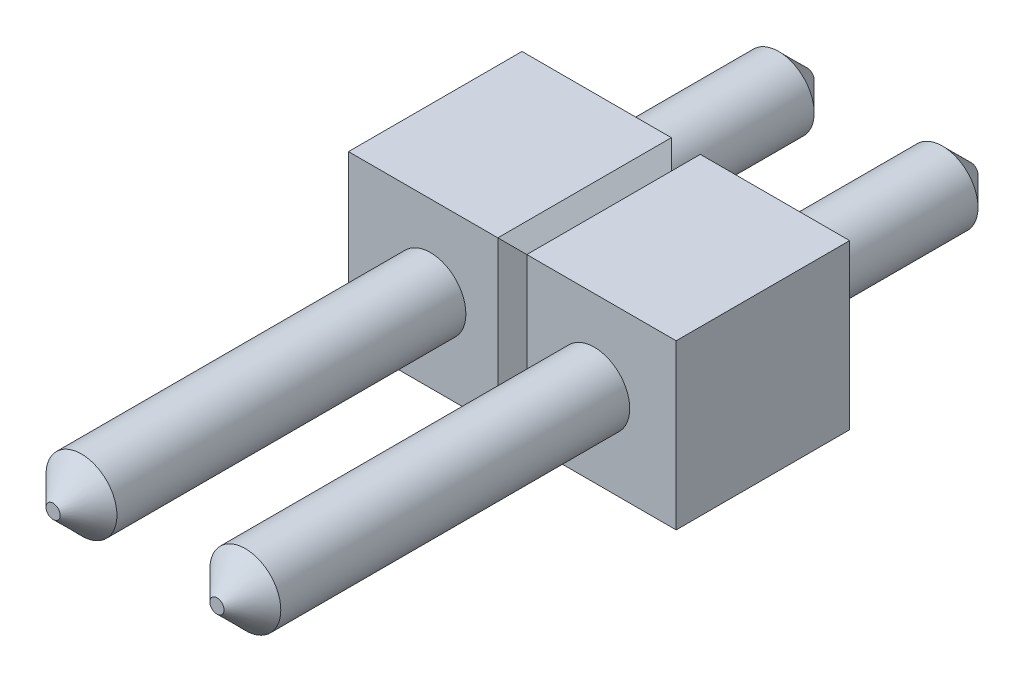
ISO-10303-21;
HEADER;
FILE_DESCRIPTION(('STEP AP214'),'2;1');
FILE_NAME('part.step','',(''),(''),'','','');
FILE_SCHEMA(('AUTOMOTIVE_DESIGN { 1 0 10303 214 1 1 1 1 }'));
ENDSEC;
DATA;
#1=APPLICATION_CONTEXT('core data for automotive mechanical design processes');
#2=APPLICATION_PROTOCOL_DEFINITION('international standard','automotive_design',2000,#1);
#3=PRODUCT_CONTEXT('',#1,'mechanical');
#4=PRODUCT('Part','Part','',(#3));
#5=PRODUCT_RELATED_PRODUCT_CATEGORY('part','',(#4));
#6=PRODUCT_DEFINITION_FORMATION('','',#4);
#7=PRODUCT_DEFINITION_CONTEXT('part definition',#1,'design');
#8=PRODUCT_DEFINITION('design','',#6,#7);
#9=PRODUCT_DEFINITION_SHAPE('','',#8);
#10=(LENGTH_UNIT() NAMED_UNIT(*) SI_UNIT(.MILLI.,.METRE.));
#11=(NAMED_UNIT(*) PLANE_ANGLE_UNIT() SI_UNIT($,.RADIAN.));
#12=(NAMED_UNIT(*) SI_UNIT($,.STERADIAN.) SOLID_ANGLE_UNIT());
#13=UNCERTAINTY_MEASURE_WITH_UNIT(LENGTH_MEASURE(1.E-05),#10,'distance_accuracy_value','');
#14=(GEOMETRIC_REPRESENTATION_CONTEXT(3) GLOBAL_UNCERTAINTY_ASSIGNED_CONTEXT((#13)) GLOBAL_UNIT_ASSIGNED_CONTEXT((#10,
#11,#12)) REPRESENTATION_CONTEXT('',''));
#15=CARTESIAN_POINT('',(0.,0.,0.));
#16=DIRECTION('',(0.,0.,1.));
#17=DIRECTION('',(1.,0.,0.));
#18=AXIS2_PLACEMENT_3D('',#15,#16,#17);
#19=CARTESIAN_POINT('',(-1.27,-1.27,0.));
#20=DIRECTION('',(1.,0.,0.));
#21=DIRECTION('',(0.,0.,1.));
#22=AXIS2_PLACEMENT_3D('',#19,#20,#21);
#23=PLANE('',#22);
#24=DIRECTION('',(0.,1.,0.));
#25=VECTOR('',#24,1.);
#26=CARTESIAN_POINT('',(-1.27,-1.27,2.69));
#27=LINE('',#26,#25);
#28=CARTESIAN_POINT('',(-1.27,-1.27,2.69));
#29=VERTEX_POINT('',#28);
#30=CARTESIAN_POINT('',(-1.27,1.27,2.69));
#31=VERTEX_POINT('',#30);
#32=EDGE_CURVE('P0_E11',#29,#31,#27,.T.);
#33=ORIENTED_EDGE('',*,*,#32,.T.);
#34=DIRECTION('',(0.,0.,1.));
#35=VECTOR('',#34,1.);
#36=CARTESIAN_POINT('',(-1.27,1.27,0.));
#37=LINE('',#36,#35);
#38=CARTESIAN_POINT('',(-1.27,1.27,0.));
#39=VERTEX_POINT('',#38);
#40=EDGE_CURVE('P0_E24',#39,#31,#37,.T.);
#41=ORIENTED_EDGE('',*,*,#40,.F.);
#42=DIRECTION('',(0.,1.,0.));
#43=VECTOR('',#42,1.);
#44=CARTESIAN_POINT('',(-1.27,-1.27,0.));
#45=LINE('',#44,#43);
#46=CARTESIAN_POINT('',(-1.27,-1.27,0.));
#47=VERTEX_POINT('',#46);
#48=EDGE_CURVE('P0_E189',#47,#39,#45,.T.);
#49=ORIENTED_EDGE('',*,*,#48,.F.);
#50=DIRECTION('',(0.,0.,1.));
#51=VECTOR('',#50,1.);
#52=CARTESIAN_POINT('',(-1.27,-1.27,0.));
#53=LINE('',#52,#51);
#54=EDGE_CURVE('P0_E36',#47,#29,#53,.T.);
#55=ORIENTED_EDGE('',*,*,#54,.T.);
#56=EDGE_LOOP('',(#33,#41,#49,#55));
#57=FACE_BOUND('',#56,.T.);
#58=ADVANCED_FACE('P0_F17',(#57),#23,.F.);
#59=CARTESIAN_POINT('',(-1.27,-1.27,0.));
#60=DIRECTION('',(0.,1.,0.));
#61=DIRECTION('',(0.,0.,1.));
#62=AXIS2_PLACEMENT_3D('',#59,#60,#61);
#63=PLANE('',#62);
#64=DIRECTION('',(0.,0.,1.));
#65=VECTOR('',#64,1.);
#66=CARTESIAN_POINT('',(1.045493596973,-1.27,0.));
#67=LINE('',#66,#65);
#68=CARTESIAN_POINT('',(1.045493596973,-1.27,0.));
#69=VERTEX_POINT('',#68);
#70=CARTESIAN_POINT('',(1.045493596973,-1.27,2.69));
#71=VERTEX_POINT('',#70);
#72=EDGE_CURVE('P0_E185',#69,#71,#67,.T.);
#73=ORIENTED_EDGE('',*,*,#72,.T.);
#74=DIRECTION('',(1.,0.,0.));
#75=VECTOR('',#74,1.);
#76=CARTESIAN_POINT('',(-1.27,-1.27,2.69));
#77=LINE('',#76,#75);
#78=EDGE_CURVE('P0_E183',#29,#71,#77,.T.);
#79=ORIENTED_EDGE('',*,*,#78,.F.);
#80=ORIENTED_EDGE('',*,*,#54,.F.);
#81=DIRECTION('',(1.,0.,0.));
#82=VECTOR('',#81,1.);
#83=CARTESIAN_POINT('',(-1.27,-1.27,0.));
#84=LINE('',#83,#82);
#85=EDGE_CURVE('P0_E181',#47,#69,#84,.T.);
#86=ORIENTED_EDGE('',*,*,#85,.T.);
#87=EDGE_LOOP('',(#73,#79,#80,#86));
#88=FACE_BOUND('',#87,.T.);
#89=ADVANCED_FACE('P0_F221',(#88),#63,.F.);
#90=CARTESIAN_POINT('',(-1.27,-1.27,2.69));
#91=DIRECTION('',(0.,0.,1.));
#92=DIRECTION('',(1.,0.,0.));
#93=AXIS2_PLACEMENT_3D('',#90,#91,#92);
#94=PLANE('',#93);
#95=DIRECTION('',(1.,0.,0.));
#96=VECTOR('',#95,1.);
#97=CARTESIAN_POINT('',(-1.27,1.27,2.69));
#98=LINE('',#97,#96);
#99=CARTESIAN_POINT('',(1.045493596973,1.27,2.69));
#100=VERTEX_POINT('',#99);
#101=EDGE_CURVE('P0_E179',#31,#100,#98,.T.);
#102=ORIENTED_EDGE('',*,*,#101,.F.);
#103=ORIENTED_EDGE('',*,*,#32,.F.);
#104=ORIENTED_EDGE('',*,*,#78,.T.);
#105=DIRECTION('',(0.,1.,0.));
#106=VECTOR('',#105,1.);
#107=CARTESIAN_POINT('',(1.045493596973,-1.27,2.69));
#108=LINE('',#107,#106);
#109=EDGE_CURVE('P0_E176',#71,#100,#108,.T.);
#110=ORIENTED_EDGE('',*,*,#109,.T.);
#111=EDGE_LOOP('',(#102,#103,#104,#110));
#112=FACE_BOUND('',#111,.T.);
#113=ADVANCED_FACE('P0_F218',(#112),#94,.T.);
#114=CARTESIAN_POINT('',(-1.27,1.27,0.));
#115=DIRECTION('',(0.,1.,0.));
#116=DIRECTION('',(0.,0.,1.));
#117=AXIS2_PLACEMENT_3D('',#114,#115,#116);
#118=PLANE('',#117);
#119=DIRECTION('',(1.,0.,0.));
#120=VECTOR('',#119,1.);
#121=CARTESIAN_POINT('',(-1.27,1.27,0.));
#122=LINE('',#121,#120);
#123=CARTESIAN_POINT('',(1.045493596973,1.27,0.));
#124=VERTEX_POINT('',#123);
#125=EDGE_CURVE('P0_E173',#39,#124,#122,.T.);
#126=ORIENTED_EDGE('',*,*,#125,.F.);
#127=ORIENTED_EDGE('',*,*,#40,.T.);
#128=ORIENTED_EDGE('',*,*,#101,.T.);
#129=DIRECTION('',(0.,0.,1.));
#130=VECTOR('',#129,1.);
#131=CARTESIAN_POINT('',(1.045493596973,1.27,0.));
#132=LINE('',#131,#130);
#133=EDGE_CURVE('P0_E170',#124,#100,#132,.T.);
#134=ORIENTED_EDGE('',*,*,#133,.F.);
#135=EDGE_LOOP('',(#126,#127,#128,#134));
#136=FACE_BOUND('',#135,.T.);
#137=ADVANCED_FACE('P0_F196',(#136),#118,.T.);
#138=CARTESIAN_POINT('',(-1.27,-1.27,0.));
#139=DIRECTION('',(0.,0.,1.));
#140=DIRECTION('',(1.,0.,0.));
#141=AXIS2_PLACEMENT_3D('',#138,#139,#140);
#142=PLANE('',#141);
#143=DIRECTION('',(0.,1.,0.));
#144=VECTOR('',#143,1.);
#145=CARTESIAN_POINT('',(1.045493596973,-1.27,0.));
#146=LINE('',#145,#144);
#147=EDGE_CURVE('P0_E167',#69,#124,#146,.T.);
#148=ORIENTED_EDGE('',*,*,#147,.F.);
#149=ORIENTED_EDGE('',*,*,#85,.F.);
#150=ORIENTED_EDGE('',*,*,#48,.T.);
#151=ORIENTED_EDGE('',*,*,#125,.T.);
#152=EDGE_LOOP('',(#148,#149,#150,#151));
#153=FACE_BOUND('',#152,.T.);
#154=ADVANCED_FACE('P0_F193',(#153),#142,.F.);
#155=CARTESIAN_POINT('',(1.045493596973,-1.27,0.));
#156=DIRECTION('',(-0.707106781186547,0.707106781186548,0.));
#157=DIRECTION('',(0.,0.,1.));
#158=AXIS2_PLACEMENT_3D('',#155,#156,#157);
#159=PLANE('',#158);
#160=DIRECTION('',(0.,0.,1.));
#161=VECTOR('',#160,1.);
#162=CARTESIAN_POINT('',(1.27,-1.045493596973,0.));
#163=LINE('',#162,#161);
#164=CARTESIAN_POINT('',(1.27,-1.045493596973,0.224506403027));
#165=VERTEX_POINT('',#164);
#166=CARTESIAN_POINT('',(1.27,-1.045493596973,2.465493596973));
#167=VERTEX_POINT('',#166);
#168=EDGE_CURVE('P0_E164',#165,#167,#163,.T.);
#169=ORIENTED_EDGE('',*,*,#168,.T.);
#170=DIRECTION('',(0.577350269189626,0.577350269189626,-0.577350269189626));
#171=VECTOR('',#170,1.);
#172=CARTESIAN_POINT('',(1.493826930307,-0.821666666667,2.241666666667));
#173=LINE('',#172,#171);
#174=EDGE_CURVE('P0_E161',#71,#167,#173,.T.);
#175=ORIENTED_EDGE('',*,*,#174,.F.);
#176=ORIENTED_EDGE('',*,*,#72,.F.);
#177=DIRECTION('',(-0.577350269189626,-0.577350269189626,-0.577350269189626));
#178=VECTOR('',#177,1.);
#179=CARTESIAN_POINT('',(1.045493596973,-1.27,0.));
#180=LINE('',#179,#178);
#181=EDGE_CURVE('P0_E158',#165,#69,#180,.T.);
#182=ORIENTED_EDGE('',*,*,#181,.F.);
#183=EDGE_LOOP('',(#169,#175,#176,#182));
#184=FACE_BOUND('',#183,.T.);
#185=ADVANCED_FACE('P0_F206',(#184),#159,.F.);
#186=CARTESIAN_POINT('',(1.045493596973,-1.27,2.69));
#187=DIRECTION('',(0.707106781186548,0.,0.707106781186548));
#188=DIRECTION('',(0.707106781186548,0.,-0.707106781186548));
#189=AXIS2_PLACEMENT_3D('',#186,#187,#188);
#190=PLANE('',#189);
#191=ORIENTED_EDGE('',*,*,#109,.F.);
#192=ORIENTED_EDGE('',*,*,#174,.T.);
#193=DIRECTION('',(0.,1.,0.));
#194=VECTOR('',#193,1.);
#195=CARTESIAN_POINT('',(1.27,-1.27,2.465493596973));
#196=LINE('',#195,#194);
#197=CARTESIAN_POINT('',(1.27,1.045493596973,2.465493596973));
#198=VERTEX_POINT('',#197);
#199=EDGE_CURVE('P0_E155',#167,#198,#196,.T.);
#200=ORIENTED_EDGE('',*,*,#199,.T.);
#201=DIRECTION('',(0.577350269189626,-0.577350269189626,-0.577350269189626));
#202=VECTOR('',#201,1.);
#203=CARTESIAN_POINT('',(1.991995731316,0.323497865658,1.743497865658));
#204=LINE('',#203,#202);
#205=EDGE_CURVE('P0_E152',#100,#198,#204,.T.);
#206=ORIENTED_EDGE('',*,*,#205,.F.);
#207=EDGE_LOOP('',(#191,#192,#200,#206));
#208=FACE_BOUND('',#207,.T.);
#209=ADVANCED_FACE('P0_F216',(#208),#190,.T.);
#210=CARTESIAN_POINT('',(1.27,1.045493596973,0.));
#211=DIRECTION('',(0.707106781186548,0.707106781186547,0.));
#212=DIRECTION('',(0.,0.,1.));
#213=AXIS2_PLACEMENT_3D('',#210,#211,#212);
#214=PLANE('',#213);
#215=DIRECTION('',(0.,0.,1.));
#216=VECTOR('',#215,1.);
#217=CARTESIAN_POINT('',(1.27,1.045493596973,0.));
#218=LINE('',#217,#216);
#219=CARTESIAN_POINT('',(1.27,1.045493596973,0.224506403027));
#220=VERTEX_POINT('',#219);
#221=EDGE_CURVE('P0_E149',#220,#198,#218,.T.);
#222=ORIENTED_EDGE('',*,*,#221,.F.);
#223=DIRECTION('',(-0.577350269189626,0.577350269189626,-0.577350269189626));
#224=VECTOR('',#223,1.);
#225=CARTESIAN_POINT('',(1.543662397982,0.771831198991,0.498168801009));
#226=LINE('',#225,#224);
#227=EDGE_CURVE('P0_E147',#220,#124,#226,.T.);
#228=ORIENTED_EDGE('',*,*,#227,.T.);
#229=ORIENTED_EDGE('',*,*,#133,.T.);
#230=ORIENTED_EDGE('',*,*,#205,.T.);
#231=EDGE_LOOP('',(#222,#228,#229,#230));
#232=FACE_BOUND('',#231,.T.);
#233=ADVANCED_FACE('P0_F238',(#232),#214,.T.);
#234=CARTESIAN_POINT('',(1.045493596973,-1.27,0.));
#235=DIRECTION('',(0.707106781186548,0.,-0.707106781186548));
#236=DIRECTION('',(0.707106781186548,0.,0.707106781186548));
#237=AXIS2_PLACEMENT_3D('',#234,#235,#236);
#238=PLANE('',#237);
#239=ORIENTED_EDGE('',*,*,#181,.T.);
#240=ORIENTED_EDGE('',*,*,#147,.T.);
#241=ORIENTED_EDGE('',*,*,#227,.F.);
#242=DIRECTION('',(0.,1.,0.));
#243=VECTOR('',#242,1.);
#244=CARTESIAN_POINT('',(1.27,-1.27,0.224506403027));
#245=LINE('',#244,#243);
#246=EDGE_CURVE('P0_E144',#165,#220,#245,.T.);
#247=ORIENTED_EDGE('',*,*,#246,.F.);
#248=EDGE_LOOP('',(#239,#240,#241,#247));
#249=FACE_BOUND('',#248,.T.);
#250=ADVANCED_FACE('P0_F200',(#249),#238,.T.);
#251=CARTESIAN_POINT('',(1.494506403027,-1.27,0.));
#252=DIRECTION('',(0.707106781186548,0.707106781186547,0.));
#253=DIRECTION('',(0.,0.,1.));
#254=AXIS2_PLACEMENT_3D('',#251,#252,#253);
#255=PLANE('',#254);
#256=DIRECTION('',(-0.577350269189626,0.577350269189626,-0.577350269189626));
#257=VECTOR('',#256,1.);
#258=CARTESIAN_POINT('',(0.971337602018,-0.746831198991,2.166831198991));
#259=LINE('',#258,#257);
#260=CARTESIAN_POINT('',(1.494506403027,-1.27,2.69));
#261=VERTEX_POINT('',#260);
#262=EDGE_CURVE('P0_E142',#261,#167,#259,.T.);
#263=ORIENTED_EDGE('',*,*,#262,.T.);
#264=ORIENTED_EDGE('',*,*,#168,.F.);
#265=DIRECTION('',(0.577350269189626,-0.577350269189626,-0.577350269189626));
#266=VECTOR('',#265,1.);
#267=CARTESIAN_POINT('',(1.419670935351,-1.195164532324,0.07483546767558));
#268=LINE('',#267,#266);
#269=CARTESIAN_POINT('',(1.494506403027,-1.27,0.));
#270=VERTEX_POINT('',#269);
#271=EDGE_CURVE('P0_E139',#165,#270,#268,.T.);
#272=ORIENTED_EDGE('',*,*,#271,.T.);
#273=DIRECTION('',(0.,0.,1.));
#274=VECTOR('',#273,1.);
#275=CARTESIAN_POINT('',(1.494506403027,-1.27,0.));
#276=LINE('',#275,#274);
#277=EDGE_CURVE('P0_E137',#270,#261,#276,.T.);
#278=ORIENTED_EDGE('',*,*,#277,.T.);
#279=EDGE_LOOP('',(#263,#264,#272,#278));
#280=FACE_BOUND('',#279,.T.);
#281=ADVANCED_FACE('P0_F210',(#280),#255,.F.);
#282=CARTESIAN_POINT('',(1.27,-1.27,2.465493596973));
#283=DIRECTION('',(0.707106781186548,0.,-0.707106781186548));
#284=DIRECTION('',(0.707106781186548,0.,0.707106781186548));
#285=AXIS2_PLACEMENT_3D('',#282,#283,#284);
#286=PLANE('',#285);
#287=DIRECTION('',(-0.577350269189626,-0.577350269189626,-0.577350269189626));
#288=VECTOR('',#287,1.);
#289=CARTESIAN_POINT('',(0.473168801009,0.248662397982,1.668662397982));
#290=LINE('',#289,#288);
#291=CARTESIAN_POINT('',(1.494506403027,1.27,2.69));
#292=VERTEX_POINT('',#291);
#293=EDGE_CURVE('P0_E135',#292,#198,#290,.T.);
#294=ORIENTED_EDGE('',*,*,#293,.T.);
#295=ORIENTED_EDGE('',*,*,#199,.F.);
#296=ORIENTED_EDGE('',*,*,#262,.F.);
#297=DIRECTION('',(0.,1.,0.));
#298=VECTOR('',#297,1.);
#299=CARTESIAN_POINT('',(1.494506403027,-1.27,2.69));
#300=LINE('',#299,#298);
#301=EDGE_CURVE('P0_E133',#261,#292,#300,.T.);
#302=ORIENTED_EDGE('',*,*,#301,.T.);
#303=EDGE_LOOP('',(#294,#295,#296,#302));
#304=FACE_BOUND('',#303,.T.);
#305=ADVANCED_FACE('P0_F245',(#304),#286,.F.);
#306=CARTESIAN_POINT('',(1.27,1.045493596973,0.));
#307=DIRECTION('',(-0.707106781186547,0.707106781186548,0.));
#308=DIRECTION('',(0.,0.,1.));
#309=AXIS2_PLACEMENT_3D('',#306,#307,#308);
#310=PLANE('',#309);
#311=DIRECTION('',(0.,0.,1.));
#312=VECTOR('',#311,1.);
#313=CARTESIAN_POINT('',(1.494506403027,1.27,0.));
#314=LINE('',#313,#312);
#315=CARTESIAN_POINT('',(1.494506403027,1.27,0.));
#316=VERTEX_POINT('',#315);
#317=EDGE_CURVE('P0_E131',#316,#292,#314,.T.);
#318=ORIENTED_EDGE('',*,*,#317,.F.);
#319=DIRECTION('',(0.577350269189626,0.577350269189626,-0.577350269189626));
#320=VECTOR('',#319,1.);
#321=CARTESIAN_POINT('',(0.921502134342,0.696995731316,0.573004268684));
#322=LINE('',#321,#320);
#323=EDGE_CURVE('P0_E128',#220,#316,#322,.T.);
#324=ORIENTED_EDGE('',*,*,#323,.F.);
#325=ORIENTED_EDGE('',*,*,#221,.T.);
#326=ORIENTED_EDGE('',*,*,#293,.F.);
#327=EDGE_LOOP('',(#318,#324,#325,#326));
#328=FACE_BOUND('',#327,.T.);
#329=ADVANCED_FACE('P0_F248',(#328),#310,.T.);
#330=CARTESIAN_POINT('',(1.27,-1.27,0.224506403027));
#331=DIRECTION('',(0.707106781186548,0.,0.707106781186548));
#332=DIRECTION('',(0.707106781186548,0.,-0.707106781186548));
#333=AXIS2_PLACEMENT_3D('',#330,#331,#332);
#334=PLANE('',#333);
#335=ORIENTED_EDGE('',*,*,#323,.T.);
#336=DIRECTION('',(0.,1.,0.));
#337=VECTOR('',#336,1.);
#338=CARTESIAN_POINT('',(1.494506403027,-1.27,0.));
#339=LINE('',#338,#337);
#340=EDGE_CURVE('P0_E100',#270,#316,#339,.T.);
#341=ORIENTED_EDGE('',*,*,#340,.F.);
#342=ORIENTED_EDGE('',*,*,#271,.F.);
#343=ORIENTED_EDGE('',*,*,#246,.T.);
#344=EDGE_LOOP('',(#335,#341,#342,#343));
#345=FACE_BOUND('',#344,.T.);
#346=ADVANCED_FACE('P0_F251',(#345),#334,.F.);
#347=CARTESIAN_POINT('',(-1.27,-1.27,0.));
#348=DIRECTION('',(0.,1.,0.));
#349=DIRECTION('',(0.,0.,1.));
#350=AXIS2_PLACEMENT_3D('',#347,#348,#349);
#351=PLANE('',#350);
#352=DIRECTION('',(0.,0.,1.));
#353=VECTOR('',#352,1.);
#354=CARTESIAN_POINT('',(3.81,-1.27,0.));
#355=LINE('',#354,#353);
#356=CARTESIAN_POINT('',(3.81,-1.27,0.));
#357=VERTEX_POINT('',#356);
#358=CARTESIAN_POINT('',(3.81,-1.27,2.69));
#359=VERTEX_POINT('',#358);
#360=EDGE_CURVE('P0_E117',#357,#359,#355,.T.);
#361=ORIENTED_EDGE('',*,*,#360,.T.);
#362=DIRECTION('',(1.,0.,0.));
#363=VECTOR('',#362,1.);
#364=CARTESIAN_POINT('',(-1.27,-1.27,2.69));
#365=LINE('',#364,#363);
#366=EDGE_CURVE('P0_E124',#261,#359,#365,.T.);
#367=ORIENTED_EDGE('',*,*,#366,.F.);
#368=ORIENTED_EDGE('',*,*,#277,.F.);
#369=DIRECTION('',(1.,0.,0.));
#370=VECTOR('',#369,1.);
#371=CARTESIAN_POINT('',(-1.27,-1.27,0.));
#372=LINE('',#371,#370);
#373=EDGE_CURVE('P0_E122',#270,#357,#372,.T.);
#374=ORIENTED_EDGE('',*,*,#373,.T.);
#375=EDGE_LOOP('',(#361,#367,#368,#374));
#376=FACE_BOUND('',#375,.T.);
#377=ADVANCED_FACE('P0_F255',(#376),#351,.F.);
#378=CARTESIAN_POINT('',(-1.27,-1.27,2.69));
#379=DIRECTION('',(0.,0.,1.));
#380=DIRECTION('',(1.,0.,0.));
#381=AXIS2_PLACEMENT_3D('',#378,#379,#380);
#382=PLANE('',#381);
#383=DIRECTION('',(1.,0.,0.));
#384=VECTOR('',#383,1.);
#385=CARTESIAN_POINT('',(-1.27,1.27,2.69));
#386=LINE('',#385,#384);
#387=CARTESIAN_POINT('',(3.81,1.27,2.69));
#388=VERTEX_POINT('',#387);
#389=EDGE_CURVE('P0_E109',#292,#388,#386,.T.);
#390=ORIENTED_EDGE('',*,*,#389,.F.);
#391=ORIENTED_EDGE('',*,*,#301,.F.);
#392=ORIENTED_EDGE('',*,*,#366,.T.);
#393=DIRECTION('',(0.,1.,0.));
#394=VECTOR('',#393,1.);
#395=CARTESIAN_POINT('',(3.81,-1.27,2.69));
#396=LINE('',#395,#394);
#397=EDGE_CURVE('P0_E103',#359,#388,#396,.T.);
#398=ORIENTED_EDGE('',*,*,#397,.T.);
#399=EDGE_LOOP('',(#390,#391,#392,#398));
#400=FACE_BOUND('',#399,.T.);
#401=ADVANCED_FACE('P0_F259',(#400),#382,.T.);
#402=CARTESIAN_POINT('',(-1.27,1.27,0.));
#403=DIRECTION('',(0.,1.,0.));
#404=DIRECTION('',(0.,0.,1.));
#405=AXIS2_PLACEMENT_3D('',#402,#403,#404);
#406=PLANE('',#405);
#407=DIRECTION('',(1.,0.,0.));
#408=VECTOR('',#407,1.);
#409=CARTESIAN_POINT('',(-1.27,1.27,0.));
#410=LINE('',#409,#408);
#411=CARTESIAN_POINT('',(3.81,1.27,0.));
#412=VERTEX_POINT('',#411);
#413=EDGE_CURVE('P0_E93',#316,#412,#410,.T.);
#414=ORIENTED_EDGE('',*,*,#413,.F.);
#415=ORIENTED_EDGE('',*,*,#317,.T.);
#416=ORIENTED_EDGE('',*,*,#389,.T.);
#417=DIRECTION('',(0.,0.,1.));
#418=VECTOR('',#417,1.);
#419=CARTESIAN_POINT('',(3.81,1.27,0.));
#420=LINE('',#419,#418);
#421=EDGE_CURVE('P0_E104',#412,#388,#420,.T.);
#422=ORIENTED_EDGE('',*,*,#421,.F.);
#423=EDGE_LOOP('',(#414,#415,#416,#422));
#424=FACE_BOUND('',#423,.T.);
#425=ADVANCED_FACE('P0_F107',(#424),#406,.T.);
#426=CARTESIAN_POINT('',(-1.27,-1.27,0.));
#427=DIRECTION('',(0.,0.,1.));
#428=DIRECTION('',(1.,0.,0.));
#429=AXIS2_PLACEMENT_3D('',#426,#427,#428);
#430=PLANE('',#429);
#431=DIRECTION('',(0.,1.,0.));
#432=VECTOR('',#431,1.);
#433=CARTESIAN_POINT('',(3.81,-1.27,0.));
#434=LINE('',#433,#432);
#435=EDGE_CURVE('P0_E98',#357,#412,#434,.T.);
#436=ORIENTED_EDGE('',*,*,#435,.F.);
#437=ORIENTED_EDGE('',*,*,#373,.F.);
#438=ORIENTED_EDGE('',*,*,#340,.T.);
#439=ORIENTED_EDGE('',*,*,#413,.T.);
#440=EDGE_LOOP('',(#436,#437,#438,#439));
#441=FACE_BOUND('',#440,.T.);
#442=ADVANCED_FACE('P0_F95',(#441),#430,.F.);
#443=CARTESIAN_POINT('',(3.81,-1.27,0.));
#444=DIRECTION('',(1.,0.,0.));
#445=DIRECTION('',(0.,0.,1.));
#446=AXIS2_PLACEMENT_3D('',#443,#444,#445);
#447=PLANE('',#446);
#448=ORIENTED_EDGE('',*,*,#360,.F.);
#449=ORIENTED_EDGE('',*,*,#435,.T.);
#450=ORIENTED_EDGE('',*,*,#421,.T.);
#451=ORIENTED_EDGE('',*,*,#397,.F.);
#452=EDGE_LOOP('',(#448,#449,#450,#451));
#453=FACE_BOUND('',#452,.T.);
#454=ADVANCED_FACE('P0_F115',(#453),#447,.T.);
#455=CLOSED_SHELL('',(#58,#89,#113,#137,#154,#185,#209,#233,#250,#281,#305,#329,#346,#377,#401,
#425,#442,#454));
#456=MANIFOLD_SOLID_BREP('P0_B1',#455);
#457=CARTESIAN_POINT('',(0.,0.,-3.15));
#458=DIRECTION('',(0.,0.,1.));
#459=DIRECTION('',(1.,0.,0.));
#460=AXIS2_PLACEMENT_3D('',#457,#458,#459);
#461=CYLINDRICAL_SURFACE('',#460,0.55);
#462=DIRECTION('',(0.,0.,1.));
#463=VECTOR('',#462,1.);
#464=CARTESIAN_POINT('',(0.55,0.,-3.15));
#465=LINE('',#464,#463);
#466=CARTESIAN_POINT('',(0.55,0.,-2.71));
#467=VERTEX_POINT('',#466);
#468=CARTESIAN_POINT('',(0.55,0.,8.1));
#469=VERTEX_POINT('',#468);
#470=EDGE_CURVE('P1_E11',#467,#469,#465,.T.);
#471=ORIENTED_EDGE('',*,*,#470,.T.);
#472=CARTESIAN_POINT('',(0.,0.,8.1));
#473=DIRECTION('',(0.,0.,1.));
#474=DIRECTION('',(1.,0.,0.));
#475=AXIS2_PLACEMENT_3D('',#472,#473,#474);
#476=CIRCLE('',#475,0.55);
#477=EDGE_CURVE('P1_E24',#469,#469,#476,.T.);
#478=ORIENTED_EDGE('',*,*,#477,.F.);
#479=ORIENTED_EDGE('',*,*,#470,.F.);
#480=CARTESIAN_POINT('',(0.,0.,-2.71));
#481=DIRECTION('',(0.,0.,1.));
#482=DIRECTION('',(1.,0.,0.));
#483=AXIS2_PLACEMENT_3D('',#480,#481,#482);
#484=CIRCLE('',#483,0.55);
#485=EDGE_CURVE('P1_E54',#467,#467,#484,.T.);
#486=ORIENTED_EDGE('',*,*,#485,.T.);
#487=EDGE_LOOP('',(#471,#478,#479,#486));
#488=FACE_BOUND('',#487,.T.);
#489=ADVANCED_FACE('P1_F17',(#488),#461,.T.);
#490=CARTESIAN_POINT('',(0.,0.,-2.71));
#491=DIRECTION('',(0.,0.,1.));
#492=DIRECTION('',(1.,0.,0.));
#493=AXIS2_PLACEMENT_3D('',#490,#491,#492);
#494=CONICAL_SURFACE('',#493,0.55,0.785398163397);
#495=CARTESIAN_POINT('',(0.,0.,-3.15));
#496=DIRECTION('',(0.,0.,1.));
#497=DIRECTION('',(1.,0.,0.));
#498=AXIS2_PLACEMENT_3D('',#495,#496,#497);
#499=CIRCLE('',#498,0.11);
#500=CARTESIAN_POINT('',(0.11,0.,-3.15));
#501=VERTEX_POINT('',#500);
#502=EDGE_CURVE('P1_E52',#501,#501,#499,.T.);
#503=ORIENTED_EDGE('',*,*,#502,.T.);
#504=DIRECTION('',(-0.707106781186548,0.,-0.707106781186548));
#505=VECTOR('',#504,1.);
#506=CARTESIAN_POINT('',(0.55,0.,-2.71));
#507=LINE('',#506,#505);
#508=EDGE_CURVE('P1_E44',#467,#501,#507,.T.);
#509=ORIENTED_EDGE('',*,*,#508,.F.);
#510=ORIENTED_EDGE('',*,*,#485,.F.);
#511=ORIENTED_EDGE('',*,*,#508,.T.);
#512=EDGE_LOOP('',(#503,#509,#510,#511));
#513=FACE_BOUND('',#512,.T.);
#514=ADVANCED_FACE('P1_F58',(#513),#494,.T.);
#515=CARTESIAN_POINT('',(0.,0.,8.1));
#516=DIRECTION('',(0.,0.,-1.));
#517=DIRECTION('',(1.,0.,0.));
#518=AXIS2_PLACEMENT_3D('',#515,#516,#517);
#519=CONICAL_SURFACE('',#518,0.55,0.785398163397);
#520=DIRECTION('',(-0.707106781186548,0.,0.707106781186548));
#521=VECTOR('',#520,1.);
#522=CARTESIAN_POINT('',(0.55,0.,8.1));
#523=LINE('',#522,#521);
#524=CARTESIAN_POINT('',(0.11,0.,8.54));
#525=VERTEX_POINT('',#524);
#526=EDGE_CURVE('P1_E40',#469,#525,#523,.T.);
#527=ORIENTED_EDGE('',*,*,#526,.F.);
#528=ORIENTED_EDGE('',*,*,#477,.T.);
#529=ORIENTED_EDGE('',*,*,#526,.T.);
#530=CARTESIAN_POINT('',(0.,0.,8.54));
#531=DIRECTION('',(0.,0.,1.));
#532=DIRECTION('',(1.,0.,0.));
#533=AXIS2_PLACEMENT_3D('',#530,#531,#532);
#534=CIRCLE('',#533,0.11);
#535=EDGE_CURVE('P1_E43',#525,#525,#534,.T.);
#536=ORIENTED_EDGE('',*,*,#535,.F.);
#537=EDGE_LOOP('',(#527,#528,#529,#536));
#538=FACE_BOUND('',#537,.T.);
#539=ADVANCED_FACE('P1_F42',(#538),#519,.T.);
#540=CARTESIAN_POINT('',(0.,0.,-3.15));
#541=DIRECTION('',(0.,0.,1.));
#542=DIRECTION('',(1.,0.,0.));
#543=AXIS2_PLACEMENT_3D('',#540,#541,#542);
#544=PLANE('',#543);
#545=ORIENTED_EDGE('',*,*,#502,.F.);
#546=EDGE_LOOP('',(#545));
#547=FACE_BOUND('',#546,.T.);
#548=ADVANCED_FACE('P1_F61',(#547),#544,.F.);
#549=CARTESIAN_POINT('',(0.,0.,8.54));
#550=DIRECTION('',(0.,0.,1.));
#551=DIRECTION('',(1.,0.,0.));
#552=AXIS2_PLACEMENT_3D('',#549,#550,#551);
#553=PLANE('',#552);
#554=ORIENTED_EDGE('',*,*,#535,.T.);
#555=EDGE_LOOP('',(#554));
#556=FACE_BOUND('',#555,.T.);
#557=ADVANCED_FACE('P1_F47',(#556),#553,.T.);
#558=CLOSED_SHELL('',(#489,#514,#539,#548,#557));
#559=MANIFOLD_SOLID_BREP('P1_B1',#558);
#560=CARTESIAN_POINT('',(2.54,0.,-3.15));
#561=DIRECTION('',(0.,0.,1.));
#562=DIRECTION('',(1.,0.,0.));
#563=AXIS2_PLACEMENT_3D('',#560,#561,#562);
#564=CYLINDRICAL_SURFACE('',#563,0.55);
#565=DIRECTION('',(0.,0.,1.));
#566=VECTOR('',#565,1.);
#567=CARTESIAN_POINT('',(3.09,0.,-3.15));
#568=LINE('',#567,#566);
#569=CARTESIAN_POINT('',(3.09,0.,-2.71));
#570=VERTEX_POINT('',#569);
#571=CARTESIAN_POINT('',(3.09,0.,8.1));
#572=VERTEX_POINT('',#571);
#573=EDGE_CURVE('P2_E10',#570,#572,#568,.T.);
#574=ORIENTED_EDGE('',*,*,#573,.T.);
#575=CARTESIAN_POINT('',(2.54,0.,8.1));
#576=DIRECTION('',(0.,0.,1.));
#577=DIRECTION('',(1.,0.,0.));
#578=AXIS2_PLACEMENT_3D('',#575,#576,#577);
#579=CIRCLE('',#578,0.55);
#580=EDGE_CURVE('P2_E23',#572,#572,#579,.T.);
#581=ORIENTED_EDGE('',*,*,#580,.F.);
#582=ORIENTED_EDGE('',*,*,#573,.F.);
#583=CARTESIAN_POINT('',(2.54,0.,-2.71));
#584=DIRECTION('',(0.,0.,1.));
#585=DIRECTION('',(1.,0.,0.));
#586=AXIS2_PLACEMENT_3D('',#583,#584,#585);
#587=CIRCLE('',#586,0.55);
#588=EDGE_CURVE('P2_E53',#570,#570,#587,.T.);
#589=ORIENTED_EDGE('',*,*,#588,.T.);
#590=EDGE_LOOP('',(#574,#581,#582,#589));
#591=FACE_BOUND('',#590,.T.);
#592=ADVANCED_FACE('P2_F16',(#591),#564,.T.);
#593=CARTESIAN_POINT('',(2.54,0.,-2.71));
#594=DIRECTION('',(0.,0.,1.));
#595=DIRECTION('',(1.,0.,0.));
#596=AXIS2_PLACEMENT_3D('',#593,#594,#595);
#597=CONICAL_SURFACE('',#596,0.55,0.785398163397);
#598=CARTESIAN_POINT('',(2.54,0.,-3.15));
#599=DIRECTION('',(0.,0.,1.));
#600=DIRECTION('',(1.,0.,0.));
#601=AXIS2_PLACEMENT_3D('',#598,#599,#600);
#602=CIRCLE('',#601,0.11);
#603=CARTESIAN_POINT('',(2.65,0.,-3.15));
#604=VERTEX_POINT('',#603);
#605=EDGE_CURVE('P2_E51',#604,#604,#602,.T.);
#606=ORIENTED_EDGE('',*,*,#605,.T.);
#607=DIRECTION('',(-0.707106781186548,0.,-0.707106781186548));
#608=VECTOR('',#607,1.);
#609=CARTESIAN_POINT('',(3.09,0.,-2.71));
#610=LINE('',#609,#608);
#611=EDGE_CURVE('P2_E43',#570,#604,#610,.T.);
#612=ORIENTED_EDGE('',*,*,#611,.F.);
#613=ORIENTED_EDGE('',*,*,#588,.F.);
#614=ORIENTED_EDGE('',*,*,#611,.T.);
#615=EDGE_LOOP('',(#606,#612,#613,#614));
#616=FACE_BOUND('',#615,.T.);
#617=ADVANCED_FACE('P2_F57',(#616),#597,.T.);
#618=CARTESIAN_POINT('',(2.54,0.,8.1));
#619=DIRECTION('',(0.,0.,-1.));
#620=DIRECTION('',(1.,0.,0.));
#621=AXIS2_PLACEMENT_3D('',#618,#619,#620);
#622=CONICAL_SURFACE('',#621,0.55,0.785398163397);
#623=DIRECTION('',(-0.707106781186548,0.,0.707106781186548));
#624=VECTOR('',#623,1.);
#625=CARTESIAN_POINT('',(3.09,0.,8.1));
#626=LINE('',#625,#624);
#627=CARTESIAN_POINT('',(2.65,0.,8.54));
#628=VERTEX_POINT('',#627);
#629=EDGE_CURVE('P2_E39',#572,#628,#626,.T.);
#630=ORIENTED_EDGE('',*,*,#629,.F.);
#631=ORIENTED_EDGE('',*,*,#580,.T.);
#632=ORIENTED_EDGE('',*,*,#629,.T.);
#633=CARTESIAN_POINT('',(2.54,0.,8.54));
#634=DIRECTION('',(0.,0.,1.));
#635=DIRECTION('',(1.,0.,0.));
#636=AXIS2_PLACEMENT_3D('',#633,#634,#635);
#637=CIRCLE('',#636,0.11);
#638=EDGE_CURVE('P2_E42',#628,#628,#637,.T.);
#639=ORIENTED_EDGE('',*,*,#638,.F.);
#640=EDGE_LOOP('',(#630,#631,#632,#639));
#641=FACE_BOUND('',#640,.T.);
#642=ADVANCED_FACE('P2_F41',(#641),#622,.T.);
#643=CARTESIAN_POINT('',(2.54,0.,-3.15));
#644=DIRECTION('',(0.,0.,1.));
#645=DIRECTION('',(1.,0.,0.));
#646=AXIS2_PLACEMENT_3D('',#643,#644,#645);
#647=PLANE('',#646);
#648=ORIENTED_EDGE('',*,*,#605,.F.);
#649=EDGE_LOOP('',(#648));
#650=FACE_BOUND('',#649,.T.);
#651=ADVANCED_FACE('P2_F60',(#650),#647,.F.);
#652=CARTESIAN_POINT('',(2.54,0.,8.54));
#653=DIRECTION('',(0.,0.,1.));
#654=DIRECTION('',(1.,0.,0.));
#655=AXIS2_PLACEMENT_3D('',#652,#653,#654);
#656=PLANE('',#655);
#657=ORIENTED_EDGE('',*,*,#638,.T.);
#658=EDGE_LOOP('',(#657));
#659=FACE_BOUND('',#658,.T.);
#660=ADVANCED_FACE('P2_F46',(#659),#656,.T.);
#661=CLOSED_SHELL('',(#592,#617,#642,#651,#660));
#662=MANIFOLD_SOLID_BREP('P2_B1',#661);
#663=ADVANCED_BREP_SHAPE_REPRESENTATION('',(#18,#456,#559,#662),#14);
#664=SHAPE_DEFINITION_REPRESENTATION(#9,#663);
ENDSEC;
END-ISO-10303-21;
